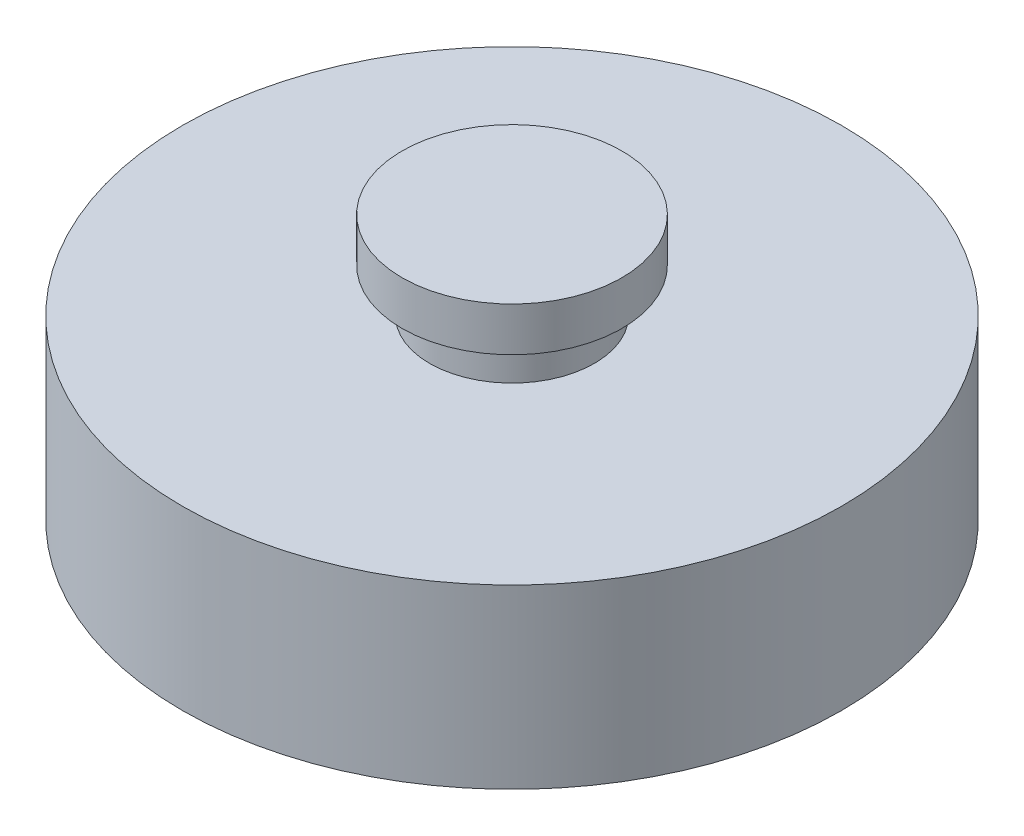
ISO-10303-21;
HEADER;
FILE_DESCRIPTION(('STEP AP214'),'2;1');
FILE_NAME('part.step','',(''),(''),'','','');
FILE_SCHEMA(('AUTOMOTIVE_DESIGN { 1 0 10303 214 1 1 1 1 }'));
ENDSEC;
DATA;
#1=APPLICATION_CONTEXT('core data for automotive mechanical design processes');
#2=APPLICATION_PROTOCOL_DEFINITION('international standard','automotive_design',2000,#1);
#3=PRODUCT_CONTEXT('',#1,'mechanical');
#4=PRODUCT('Part','Part','',(#3));
#5=PRODUCT_RELATED_PRODUCT_CATEGORY('part','',(#4));
#6=PRODUCT_DEFINITION_FORMATION('','',#4);
#7=PRODUCT_DEFINITION_CONTEXT('part definition',#1,'design');
#8=PRODUCT_DEFINITION('design','',#6,#7);
#9=PRODUCT_DEFINITION_SHAPE('','',#8);
#10=(LENGTH_UNIT() NAMED_UNIT(*) SI_UNIT(.MILLI.,.METRE.));
#11=(NAMED_UNIT(*) PLANE_ANGLE_UNIT() SI_UNIT($,.RADIAN.));
#12=(NAMED_UNIT(*) SI_UNIT($,.STERADIAN.) SOLID_ANGLE_UNIT());
#13=UNCERTAINTY_MEASURE_WITH_UNIT(LENGTH_MEASURE(1.E-05),#10,'distance_accuracy_value','');
#14=(GEOMETRIC_REPRESENTATION_CONTEXT(3) GLOBAL_UNCERTAINTY_ASSIGNED_CONTEXT((#13)) GLOBAL_UNIT_ASSIGNED_CONTEXT((#10,
#11,#12)) REPRESENTATION_CONTEXT('',''));
#15=CARTESIAN_POINT('',(0.,0.,0.));
#16=DIRECTION('',(0.,0.,1.));
#17=DIRECTION('',(1.,0.,0.));
#18=AXIS2_PLACEMENT_3D('',#15,#16,#17);
#19=CARTESIAN_POINT('',(0.,161.,0.));
#20=DIRECTION('',(0.,-1.,0.));
#21=DIRECTION('',(0.,0.,-1.));
#22=AXIS2_PLACEMENT_3D('',#19,#20,#21);
#23=CYLINDRICAL_SURFACE('',#22,300.);
#24=CARTESIAN_POINT('',(0.,161.,0.));
#25=DIRECTION('',(0.,1.,0.));
#26=DIRECTION('',(0.,0.,1.));
#27=AXIS2_PLACEMENT_3D('',#24,#25,#26);
#28=CIRCLE('',#27,300.);
#29=CARTESIAN_POINT('',(0.,161.,300.));
#30=VERTEX_POINT('',#29);
#31=EDGE_CURVE('E45',#30,#30,#28,.T.);
#32=ORIENTED_EDGE('',*,*,#31,.F.);
#33=EDGE_LOOP('',(#32));
#34=FACE_BOUND('',#33,.T.);
#35=CARTESIAN_POINT('',(0.,0.,0.));
#36=DIRECTION('',(0.,1.,0.));
#37=DIRECTION('',(0.,0.,1.));
#38=AXIS2_PLACEMENT_3D('',#35,#36,#37);
#39=CIRCLE('',#38,300.);
#40=CARTESIAN_POINT('',(0.,0.,300.));
#41=VERTEX_POINT('',#40);
#42=EDGE_CURVE('E40',#41,#41,#39,.T.);
#43=ORIENTED_EDGE('',*,*,#42,.T.);
#44=EDGE_LOOP('',(#43));
#45=FACE_BOUND('',#44,.T.);
#46=ADVANCED_FACE('F37',(#34,#45),#23,.T.);
#47=CARTESIAN_POINT('',(0.,161.,0.));
#48=DIRECTION('',(0.,1.,0.));
#49=DIRECTION('',(0.,0.,1.));
#50=AXIS2_PLACEMENT_3D('',#47,#48,#49);
#51=PLANE('',#50);
#52=CARTESIAN_POINT('',(0.,161.,0.));
#53=DIRECTION('',(0.,1.,0.));
#54=DIRECTION('',(0.,0.,1.));
#55=AXIS2_PLACEMENT_3D('',#52,#53,#54);
#56=CIRCLE('',#55,75.);
#57=CARTESIAN_POINT('',(0.,161.,75.));
#58=VERTEX_POINT('',#57);
#59=EDGE_CURVE('E10',#58,#58,#56,.T.);
#60=ORIENTED_EDGE('',*,*,#59,.F.);
#61=EDGE_LOOP('',(#60));
#62=FACE_BOUND('',#61,.T.);
#63=ORIENTED_EDGE('',*,*,#31,.T.);
#64=EDGE_LOOP('',(#63));
#65=FACE_BOUND('',#64,.T.);
#66=ADVANCED_FACE('F83',(#62,#65),#51,.T.);
#67=CARTESIAN_POINT('',(0.,0.,0.));
#68=DIRECTION('',(0.,1.,0.));
#69=DIRECTION('',(0.,0.,1.));
#70=AXIS2_PLACEMENT_3D('',#67,#68,#69);
#71=PLANE('',#70);
#72=ORIENTED_EDGE('',*,*,#42,.F.);
#73=EDGE_LOOP('',(#72));
#74=FACE_BOUND('',#73,.T.);
#75=ADVANCED_FACE('F88',(#74),#71,.F.);
#76=CARTESIAN_POINT('',(0.,201.,0.));
#77=DIRECTION('',(0.,-1.,0.));
#78=DIRECTION('',(0.,0.,-1.));
#79=AXIS2_PLACEMENT_3D('',#76,#77,#78);
#80=CYLINDRICAL_SURFACE('',#79,75.);
#81=CARTESIAN_POINT('',(0.,201.,0.));
#82=DIRECTION('',(0.,1.,0.));
#83=DIRECTION('',(0.,0.,1.));
#84=AXIS2_PLACEMENT_3D('',#81,#82,#83);
#85=CIRCLE('',#84,75.);
#86=CARTESIAN_POINT('',(0.,201.,75.));
#87=VERTEX_POINT('',#86);
#88=EDGE_CURVE('E52',#87,#87,#85,.T.);
#89=ORIENTED_EDGE('',*,*,#88,.F.);
#90=EDGE_LOOP('',(#89));
#91=FACE_BOUND('',#90,.T.);
#92=ORIENTED_EDGE('',*,*,#59,.T.);
#93=EDGE_LOOP('',(#92));
#94=FACE_BOUND('',#93,.T.);
#95=ADVANCED_FACE('F70',(#91,#94),#80,.T.);
#96=CARTESIAN_POINT('',(0.,241.,0.));
#97=DIRECTION('',(0.,-1.,0.));
#98=DIRECTION('',(0.,0.,-1.));
#99=AXIS2_PLACEMENT_3D('',#96,#97,#98);
#100=CYLINDRICAL_SURFACE('',#99,100.);
#101=CARTESIAN_POINT('',(0.,241.,0.));
#102=DIRECTION('',(0.,1.,0.));
#103=DIRECTION('',(0.,0.,1.));
#104=AXIS2_PLACEMENT_3D('',#101,#102,#103);
#105=CIRCLE('',#104,100.);
#106=CARTESIAN_POINT('',(0.,241.,100.));
#107=VERTEX_POINT('',#106);
#108=EDGE_CURVE('E56',#107,#107,#105,.T.);
#109=ORIENTED_EDGE('',*,*,#108,.F.);
#110=EDGE_LOOP('',(#109));
#111=FACE_BOUND('',#110,.T.);
#112=CARTESIAN_POINT('',(0.,201.,0.));
#113=DIRECTION('',(0.,1.,0.));
#114=DIRECTION('',(0.,0.,1.));
#115=AXIS2_PLACEMENT_3D('',#112,#113,#114);
#116=CIRCLE('',#115,100.);
#117=CARTESIAN_POINT('',(0.,201.,100.));
#118=VERTEX_POINT('',#117);
#119=EDGE_CURVE('E57',#118,#118,#116,.T.);
#120=ORIENTED_EDGE('',*,*,#119,.T.);
#121=EDGE_LOOP('',(#120));
#122=FACE_BOUND('',#121,.T.);
#123=ADVANCED_FACE('F67',(#111,#122),#100,.T.);
#124=CARTESIAN_POINT('',(0.,241.,0.));
#125=DIRECTION('',(0.,1.,0.));
#126=DIRECTION('',(0.,0.,1.));
#127=AXIS2_PLACEMENT_3D('',#124,#125,#126);
#128=PLANE('',#127);
#129=ORIENTED_EDGE('',*,*,#108,.T.);
#130=EDGE_LOOP('',(#129));
#131=FACE_BOUND('',#130,.T.);
#132=ADVANCED_FACE('F65',(#131),#128,.T.);
#133=CARTESIAN_POINT('',(0.,201.,0.));
#134=DIRECTION('',(0.,1.,0.));
#135=DIRECTION('',(0.,0.,1.));
#136=AXIS2_PLACEMENT_3D('',#133,#134,#135);
#137=PLANE('',#136);
#138=ORIENTED_EDGE('',*,*,#88,.T.);
#139=EDGE_LOOP('',(#138));
#140=FACE_BOUND('',#139,.T.);
#141=ORIENTED_EDGE('',*,*,#119,.F.);
#142=EDGE_LOOP('',(#141));
#143=FACE_BOUND('',#142,.T.);
#144=ADVANCED_FACE('F74',(#140,#143),#137,.F.);
#145=CLOSED_SHELL('',(#46,#66,#75,#95,#123,#132,#144));
#146=MANIFOLD_SOLID_BREP('B2',#145);
#147=ADVANCED_BREP_SHAPE_REPRESENTATION('',(#18,#146),#14);
#148=SHAPE_DEFINITION_REPRESENTATION(#9,#147);
ENDSEC;
END-ISO-10303-21;
